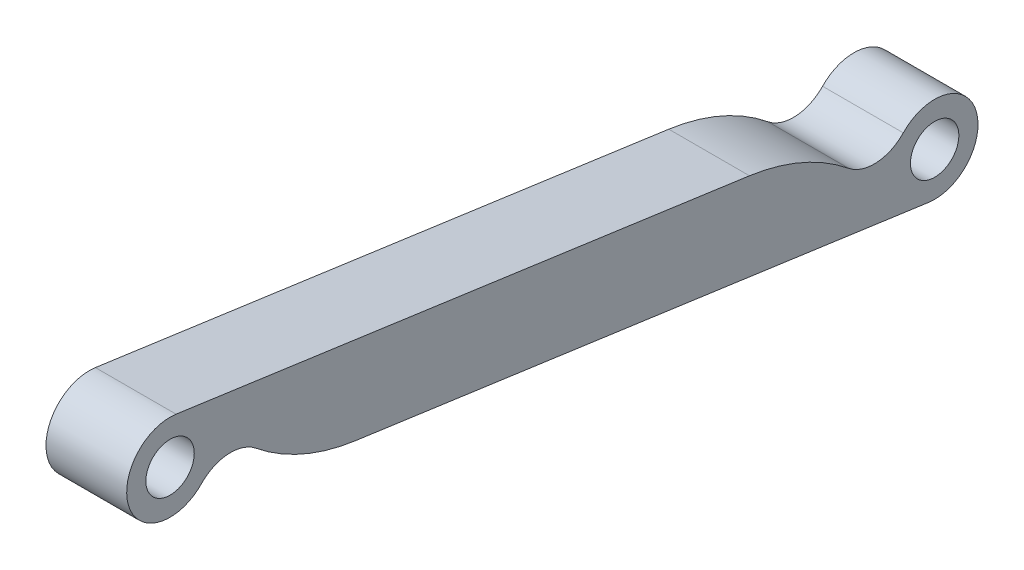
ISO-10303-21;
HEADER;
FILE_DESCRIPTION(('STEP AP214'),'2;1');
FILE_NAME('part.step','',(''),(''),'','','');
FILE_SCHEMA(('AUTOMOTIVE_DESIGN { 1 0 10303 214 1 1 1 1 }'));
ENDSEC;
DATA;
#1=APPLICATION_CONTEXT('core data for automotive mechanical design processes');
#2=APPLICATION_PROTOCOL_DEFINITION('international standard','automotive_design',2000,#1);
#3=PRODUCT_CONTEXT('',#1,'mechanical');
#4=PRODUCT('Part','Part','',(#3));
#5=PRODUCT_RELATED_PRODUCT_CATEGORY('part','',(#4));
#6=PRODUCT_DEFINITION_FORMATION('','',#4);
#7=PRODUCT_DEFINITION_CONTEXT('part definition',#1,'design');
#8=PRODUCT_DEFINITION('design','',#6,#7);
#9=PRODUCT_DEFINITION_SHAPE('','',#8);
#10=(LENGTH_UNIT() NAMED_UNIT(*) SI_UNIT(.MILLI.,.METRE.));
#11=(NAMED_UNIT(*) PLANE_ANGLE_UNIT() SI_UNIT($,.RADIAN.));
#12=(NAMED_UNIT(*) SI_UNIT($,.STERADIAN.) SOLID_ANGLE_UNIT());
#13=UNCERTAINTY_MEASURE_WITH_UNIT(LENGTH_MEASURE(1.E-05),#10,'distance_accuracy_value','');
#14=(GEOMETRIC_REPRESENTATION_CONTEXT(3) GLOBAL_UNCERTAINTY_ASSIGNED_CONTEXT((#13)) GLOBAL_UNIT_ASSIGNED_CONTEXT((#10,
#11,#12)) REPRESENTATION_CONTEXT('',''));
#15=CARTESIAN_POINT('',(0.,0.,0.));
#16=DIRECTION('',(0.,0.,1.));
#17=DIRECTION('',(1.,0.,0.));
#18=AXIS2_PLACEMENT_3D('',#15,#16,#17);
#19=CARTESIAN_POINT('',(-2.,-2.47487373415291,-40.7267905322548));
#20=DIRECTION('',(1.,0.,0.));
#21=DIRECTION('',(0.,0.,-1.));
#22=AXIS2_PLACEMENT_3D('',#19,#20,#21);
#23=CYLINDRICAL_SURFACE('',#22,2.15);
#24=DIRECTION('',(1.,0.,0.));
#25=VECTOR('',#24,1.);
#26=CARTESIAN_POINT('',(-2.,-0.989306526359159,-39.1725736647849));
#27=LINE('',#26,#25);
#28=CARTESIAN_POINT('',(-2.,-0.989306526359159,-39.1725736647849));
#29=VERTEX_POINT('',#28);
#30=CARTESIAN_POINT('',(2.,-0.989306526359159,-39.1725736647849));
#31=VERTEX_POINT('',#30);
#32=EDGE_CURVE('E108',#29,#31,#27,.T.);
#33=ORIENTED_EDGE('',*,*,#32,.T.);
#34=CARTESIAN_POINT('',(2.,-2.47487373415291,-40.7267905322548));
#35=DIRECTION('',(1.,0.,0.));
#36=DIRECTION('',(0.,0.,-1.));
#37=AXIS2_PLACEMENT_3D('',#34,#35,#36);
#38=CIRCLE('',#37,2.15);
#39=CARTESIAN_POINT('',(2.,-4.60412753999363,-40.4288337731223));
#40=VERTEX_POINT('',#39);
#41=EDGE_CURVE('E115',#40,#31,#38,.T.);
#42=ORIENTED_EDGE('',*,*,#41,.F.);
#43=DIRECTION('',(1.,0.,0.));
#44=VECTOR('',#43,1.);
#45=CARTESIAN_POINT('',(-2.,-4.60412753999363,-40.4288337731223));
#46=LINE('',#45,#44);
#47=CARTESIAN_POINT('',(-2.,-4.60412753999363,-40.4288337731223));
#48=VERTEX_POINT('',#47);
#49=EDGE_CURVE('E163',#48,#40,#46,.T.);
#50=ORIENTED_EDGE('',*,*,#49,.F.);
#51=CARTESIAN_POINT('',(-2.,-2.47487373415291,-40.7267905322548));
#52=DIRECTION('',(1.,0.,0.));
#53=DIRECTION('',(0.,0.,-1.));
#54=AXIS2_PLACEMENT_3D('',#51,#52,#53);
#55=CIRCLE('',#54,2.15);
#56=EDGE_CURVE('E121',#48,#29,#55,.T.);
#57=ORIENTED_EDGE('',*,*,#56,.T.);
#58=EDGE_LOOP('',(#33,#42,#50,#57));
#59=FACE_BOUND('',#58,.T.);
#60=ADVANCED_FACE('F39',(#59),#23,.T.);
#61=CARTESIAN_POINT('',(-2.,1.03304540486182,-0.144559028155818));
#62=DIRECTION('',(0.,-0.99035060736778,0.138584539131423));
#63=DIRECTION('',(0.,-0.138584539131423,-0.99035060736778));
#64=AXIS2_PLACEMENT_3D('',#61,#62,#63);
#65=PLANE('',#64);
#66=DIRECTION('',(0.,-0.138584539131423,-0.99035060736778));
#67=VECTOR('',#66,1.);
#68=CARTESIAN_POINT('',(2.,1.03304540486182,-0.144559028155818));
#69=LINE('',#68,#67);
#70=CARTESIAN_POINT('',(2.,-0.626904390330507,-12.0068655897107));
#71=VERTEX_POINT('',#70);
#72=EDGE_CURVE('E127',#71,#40,#69,.T.);
#73=ORIENTED_EDGE('',*,*,#72,.F.);
#74=DIRECTION('',(-1.,0.,0.));
#75=VECTOR('',#74,1.);
#76=CARTESIAN_POINT('',(-2.,-0.626904390330508,-12.0068655897107));
#77=LINE('',#76,#75);
#78=CARTESIAN_POINT('',(-2.,-0.626904390330507,-12.0068655897107));
#79=VERTEX_POINT('',#78);
#80=EDGE_CURVE('E11',#71,#79,#77,.T.);
#81=ORIENTED_EDGE('',*,*,#80,.T.);
#82=DIRECTION('',(0.,-0.138584539131423,-0.99035060736778));
#83=VECTOR('',#82,1.);
#84=CARTESIAN_POINT('',(-2.,1.03304540486182,-0.144559028155818));
#85=LINE('',#84,#83);
#86=EDGE_CURVE('E159',#79,#48,#85,.T.);
#87=ORIENTED_EDGE('',*,*,#86,.T.);
#88=ORIENTED_EDGE('',*,*,#49,.T.);
#89=EDGE_LOOP('',(#73,#81,#87,#88));
#90=FACE_BOUND('',#89,.T.);
#91=ADVANCED_FACE('F209',(#90),#65,.T.);
#92=CARTESIAN_POINT('',(-2.,-0.0390630670417487,-5.8284271247462));
#93=DIRECTION('',(1.,0.,0.));
#94=DIRECTION('',(0.,0.,-1.));
#95=AXIS2_PLACEMENT_3D('',#92,#93,#94);
#96=CYLINDRICAL_SURFACE('',#95,2.);
#97=CARTESIAN_POINT('',(-2.,-0.0390630670417487,-5.8284271247462));
#98=DIRECTION('',(1.,0.,0.));
#99=DIRECTION('',(0.,0.,-1.));
#100=AXIS2_PLACEMENT_3D('',#97,#98,#99);
#101=CIRCLE('',#100,2.);
#102=CARTESIAN_POINT('',(-2.,1.51354772468976,-7.08914110079265));
#103=VERTEX_POINT('',#102);
#104=CARTESIAN_POINT('',(-2.,1.34285991695244,-4.38264399221608));
#105=VERTEX_POINT('',#104);
#106=EDGE_CURVE('E157',#103,#105,#101,.T.);
#107=ORIENTED_EDGE('',*,*,#106,.F.);
#108=DIRECTION('',(1.,0.,0.));
#109=VECTOR('',#108,1.);
#110=CARTESIAN_POINT('',(-2.,1.51354772468976,-7.08914110079265));
#111=LINE('',#110,#109);
#112=CARTESIAN_POINT('',(2.,1.51354772468976,-7.08914110079265));
#113=VERTEX_POINT('',#112);
#114=EDGE_CURVE('E47',#103,#113,#111,.T.);
#115=ORIENTED_EDGE('',*,*,#114,.T.);
#116=CARTESIAN_POINT('',(2.,-0.0390630670417487,-5.8284271247462));
#117=DIRECTION('',(1.,0.,0.));
#118=DIRECTION('',(0.,0.,-1.));
#119=AXIS2_PLACEMENT_3D('',#116,#117,#118);
#120=CIRCLE('',#119,2.);
#121=CARTESIAN_POINT('',(2.,1.34285991695244,-4.38264399221608));
#122=VERTEX_POINT('',#121);
#123=EDGE_CURVE('E139',#113,#122,#120,.T.);
#124=ORIENTED_EDGE('',*,*,#123,.T.);
#125=DIRECTION('',(1.,0.,0.));
#126=VECTOR('',#125,1.);
#127=CARTESIAN_POINT('',(-2.,1.34285991695244,-4.38264399221608));
#128=LINE('',#127,#126);
#129=EDGE_CURVE('E165',#105,#122,#128,.T.);
#130=ORIENTED_EDGE('',*,*,#129,.F.);
#131=EDGE_LOOP('',(#107,#115,#124,#130));
#132=FACE_BOUND('',#131,.T.);
#133=ADVANCED_FACE('F182',(#132),#96,.F.);
#134=CARTESIAN_POINT('',(-2.,2.82842712474619,-2.82842712474619));
#135=DIRECTION('',(1.,0.,0.));
#136=DIRECTION('',(0.,0.,-1.));
#137=AXIS2_PLACEMENT_3D('',#134,#135,#136);
#138=CYLINDRICAL_SURFACE('',#137,2.15);
#139=ORIENTED_EDGE('',*,*,#129,.T.);
#140=CARTESIAN_POINT('',(2.,2.82842712474619,-2.82842712474619));
#141=DIRECTION('',(1.,0.,0.));
#142=DIRECTION('',(0.,0.,-1.));
#143=AXIS2_PLACEMENT_3D('',#140,#141,#142);
#144=CIRCLE('',#143,2.15);
#145=CARTESIAN_POINT('',(2.,4.95768093058691,-3.12638388387876));
#146=VERTEX_POINT('',#145);
#147=EDGE_CURVE('E136',#146,#122,#144,.T.);
#148=ORIENTED_EDGE('',*,*,#147,.F.);
#149=DIRECTION('',(1.,0.,0.));
#150=VECTOR('',#149,1.);
#151=CARTESIAN_POINT('',(-2.,4.95768093058691,-3.12638388387876));
#152=LINE('',#151,#150);
#153=CARTESIAN_POINT('',(-2.,4.95768093058691,-3.12638388387876));
#154=VERTEX_POINT('',#153);
#155=EDGE_CURVE('E122',#154,#146,#152,.T.);
#156=ORIENTED_EDGE('',*,*,#155,.F.);
#157=CARTESIAN_POINT('',(-2.,2.82842712474619,-2.82842712474619));
#158=DIRECTION('',(1.,0.,0.));
#159=DIRECTION('',(0.,0.,-1.));
#160=AXIS2_PLACEMENT_3D('',#157,#158,#159);
#161=CIRCLE('',#160,2.15);
#162=EDGE_CURVE('E154',#154,#105,#161,.T.);
#163=ORIENTED_EDGE('',*,*,#162,.T.);
#164=EDGE_LOOP('',(#139,#148,#156,#163));
#165=FACE_BOUND('',#164,.T.);
#166=ADVANCED_FACE('F188',(#165),#138,.T.);
#167=CARTESIAN_POINT('',(-2.,5.29155301654327,-0.740472546420939));
#168=DIRECTION('',(0.,-0.99035060736778,0.138584539131423));
#169=DIRECTION('',(0.,-0.138584539131424,-0.99035060736778));
#170=AXIS2_PLACEMENT_3D('',#167,#168,#169);
#171=PLANE('',#170);
#172=DIRECTION('',(0.,-0.138584539131423,-0.99035060736778));
#173=VECTOR('',#172,1.);
#174=CARTESIAN_POINT('',(2.,5.29155301654327,-0.740472546420939));
#175=LINE('',#174,#173);
#176=CARTESIAN_POINT('',(2.,0.980457780923789,-31.5483520672903));
#177=VERTEX_POINT('',#176);
#178=EDGE_CURVE('E114',#146,#177,#175,.T.);
#179=ORIENTED_EDGE('',*,*,#178,.T.);
#180=DIRECTION('',(1.,0.,0.));
#181=VECTOR('',#180,1.);
#182=CARTESIAN_POINT('',(-2.,0.980457780923787,-31.5483520672903));
#183=LINE('',#182,#181);
#184=CARTESIAN_POINT('',(-2.,0.980457780923789,-31.5483520672903));
#185=VERTEX_POINT('',#184);
#186=EDGE_CURVE('E174',#177,#185,#183,.F.);
#187=ORIENTED_EDGE('',*,*,#186,.T.);
#188=DIRECTION('',(0.,-0.138584539131423,-0.99035060736778));
#189=VECTOR('',#188,1.);
#190=CARTESIAN_POINT('',(-2.,5.29155301654327,-0.740472546420939));
#191=LINE('',#190,#189);
#192=EDGE_CURVE('E151',#154,#185,#191,.T.);
#193=ORIENTED_EDGE('',*,*,#192,.F.);
#194=ORIENTED_EDGE('',*,*,#155,.T.);
#195=EDGE_LOOP('',(#179,#187,#193,#194));
#196=FACE_BOUND('',#195,.T.);
#197=ADVANCED_FACE('F198',(#196),#171,.F.);
#198=CARTESIAN_POINT('',(-2.,0.392616457635025,-37.7267905322548));
#199=DIRECTION('',(1.,0.,0.));
#200=DIRECTION('',(0.,0.,-1.));
#201=AXIS2_PLACEMENT_3D('',#198,#199,#200);
#202=CYLINDRICAL_SURFACE('',#201,2.);
#203=CARTESIAN_POINT('',(-2.,0.392616457635025,-37.7267905322548));
#204=DIRECTION('',(1.,0.,0.));
#205=DIRECTION('',(0.,0.,-1.));
#206=AXIS2_PLACEMENT_3D('',#203,#204,#205);
#207=CIRCLE('',#206,2.);
#208=CARTESIAN_POINT('',(-2.,-1.15999433409648,-36.4660765562084));
#209=VERTEX_POINT('',#208);
#210=EDGE_CURVE('E149',#209,#29,#207,.T.);
#211=ORIENTED_EDGE('',*,*,#210,.F.);
#212=DIRECTION('',(1.,0.,0.));
#213=VECTOR('',#212,1.);
#214=CARTESIAN_POINT('',(-2.,-1.15999433409648,-36.4660765562084));
#215=LINE('',#214,#213);
#216=CARTESIAN_POINT('',(2.,-1.15999433409648,-36.4660765562084));
#217=VERTEX_POINT('',#216);
#218=EDGE_CURVE('E111',#209,#217,#215,.T.);
#219=ORIENTED_EDGE('',*,*,#218,.T.);
#220=CARTESIAN_POINT('',(2.,0.392616457635025,-37.7267905322548));
#221=DIRECTION('',(1.,0.,0.));
#222=DIRECTION('',(0.,0.,-1.));
#223=AXIS2_PLACEMENT_3D('',#220,#221,#222);
#224=CIRCLE('',#223,2.);
#225=EDGE_CURVE('E104',#217,#31,#224,.T.);
#226=ORIENTED_EDGE('',*,*,#225,.T.);
#227=ORIENTED_EDGE('',*,*,#32,.F.);
#228=EDGE_LOOP('',(#211,#219,#226,#227));
#229=FACE_BOUND('',#228,.T.);
#230=ADVANCED_FACE('F107',(#229),#202,.F.);
#231=CARTESIAN_POINT('',(-2.,-2.47487373415291,-40.7267905322548));
#232=DIRECTION('',(1.,0.,0.));
#233=DIRECTION('',(0.,0.,-1.));
#234=AXIS2_PLACEMENT_3D('',#231,#232,#233);
#235=CYLINDRICAL_SURFACE('',#234,1.2);
#236=CARTESIAN_POINT('',(-2.,-2.47487373415291,-40.7267905322548));
#237=DIRECTION('',(1.,0.,0.));
#238=DIRECTION('',(0.,0.,-1.));
#239=AXIS2_PLACEMENT_3D('',#236,#237,#238);
#240=CIRCLE('',#239,1.2);
#241=CARTESIAN_POINT('',(-2.,-2.47487373415291,-41.9267905322548));
#242=VERTEX_POINT('',#241);
#243=EDGE_CURVE('E145',#242,#242,#240,.T.);
#244=ORIENTED_EDGE('',*,*,#243,.F.);
#245=EDGE_LOOP('',(#244));
#246=FACE_BOUND('',#245,.T.);
#247=CARTESIAN_POINT('',(2.,-2.47487373415291,-40.7267905322548));
#248=DIRECTION('',(1.,0.,0.));
#249=DIRECTION('',(0.,0.,-1.));
#250=AXIS2_PLACEMENT_3D('',#247,#248,#249);
#251=CIRCLE('',#250,1.2);
#252=CARTESIAN_POINT('',(2.,-2.47487373415291,-41.9267905322548));
#253=VERTEX_POINT('',#252);
#254=EDGE_CURVE('E129',#253,#253,#251,.T.);
#255=ORIENTED_EDGE('',*,*,#254,.T.);
#256=EDGE_LOOP('',(#255));
#257=FACE_BOUND('',#256,.T.);
#258=ADVANCED_FACE('F205',(#246,#257),#235,.F.);
#259=CARTESIAN_POINT('',(-2.,2.82842712474619,-2.82842712474619));
#260=DIRECTION('',(1.,0.,0.));
#261=DIRECTION('',(0.,0.,-1.));
#262=AXIS2_PLACEMENT_3D('',#259,#260,#261);
#263=CYLINDRICAL_SURFACE('',#262,1.2);
#264=CARTESIAN_POINT('',(-2.,2.82842712474619,-2.82842712474619));
#265=DIRECTION('',(1.,0.,0.));
#266=DIRECTION('',(0.,0.,-1.));
#267=AXIS2_PLACEMENT_3D('',#264,#265,#266);
#268=CIRCLE('',#267,1.2);
#269=CARTESIAN_POINT('',(-2.,2.82842712474619,-4.02842712474619));
#270=VERTEX_POINT('',#269);
#271=EDGE_CURVE('E123',#270,#270,#268,.T.);
#272=ORIENTED_EDGE('',*,*,#271,.F.);
#273=EDGE_LOOP('',(#272));
#274=FACE_BOUND('',#273,.T.);
#275=CARTESIAN_POINT('',(2.,2.82842712474619,-2.82842712474619));
#276=DIRECTION('',(1.,0.,0.));
#277=DIRECTION('',(0.,0.,-1.));
#278=AXIS2_PLACEMENT_3D('',#275,#276,#277);
#279=CIRCLE('',#278,1.2);
#280=CARTESIAN_POINT('',(2.,2.82842712474619,-4.02842712474619));
#281=VERTEX_POINT('',#280);
#282=EDGE_CURVE('E142',#281,#281,#279,.T.);
#283=ORIENTED_EDGE('',*,*,#282,.T.);
#284=EDGE_LOOP('',(#283));
#285=FACE_BOUND('',#284,.T.);
#286=ADVANCED_FACE('F217',(#274,#285),#263,.F.);
#287=CARTESIAN_POINT('',(-2.,0.,0.));
#288=DIRECTION('',(1.,0.,0.));
#289=DIRECTION('',(0.,0.,-1.));
#290=AXIS2_PLACEMENT_3D('',#287,#288,#289);
#291=PLANE('',#290);
#292=ORIENTED_EDGE('',*,*,#243,.T.);
#293=EDGE_LOOP('',(#292));
#294=FACE_BOUND('',#293,.T.);
#295=ORIENTED_EDGE('',*,*,#192,.T.);
#296=CARTESIAN_POINT('',(-2.,-8.92304829275401,-30.1625066759761));
#297=DIRECTION('',(1.,0.,0.));
#298=DIRECTION('',(0.,0.,-1.));
#299=AXIS2_PLACEMENT_3D('',#296,#297,#298);
#300=CIRCLE('',#299,10.);
#301=EDGE_CURVE('E177',#185,#209,#300,.F.);
#302=ORIENTED_EDGE('',*,*,#301,.T.);
#303=ORIENTED_EDGE('',*,*,#210,.T.);
#304=ORIENTED_EDGE('',*,*,#56,.F.);
#305=ORIENTED_EDGE('',*,*,#86,.F.);
#306=CARTESIAN_POINT('',(-2.,9.27660168334729,-13.3927109810249));
#307=DIRECTION('',(1.,0.,0.));
#308=DIRECTION('',(0.,0.,-1.));
#309=AXIS2_PLACEMENT_3D('',#306,#307,#308);
#310=CIRCLE('',#309,10.);
#311=EDGE_CURVE('E54',#79,#103,#310,.F.);
#312=ORIENTED_EDGE('',*,*,#311,.T.);
#313=ORIENTED_EDGE('',*,*,#106,.T.);
#314=ORIENTED_EDGE('',*,*,#162,.F.);
#315=EDGE_LOOP('',(#295,#302,#303,#304,#305,#312,#313,#314));
#316=FACE_BOUND('',#315,.T.);
#317=ORIENTED_EDGE('',*,*,#271,.T.);
#318=EDGE_LOOP('',(#317));
#319=FACE_BOUND('',#318,.T.);
#320=ADVANCED_FACE('F191',(#294,#316,#319),#291,.F.);
#321=CARTESIAN_POINT('',(2.,0.,0.));
#322=DIRECTION('',(1.,0.,0.));
#323=DIRECTION('',(0.,0.,-1.));
#324=AXIS2_PLACEMENT_3D('',#321,#322,#323);
#325=PLANE('',#324);
#326=ORIENTED_EDGE('',*,*,#254,.F.);
#327=EDGE_LOOP('',(#326));
#328=FACE_BOUND('',#327,.T.);
#329=ORIENTED_EDGE('',*,*,#225,.F.);
#330=CARTESIAN_POINT('',(2.,-8.92304829275401,-30.1625066759761));
#331=DIRECTION('',(1.,0.,0.));
#332=DIRECTION('',(0.,0.,-1.));
#333=AXIS2_PLACEMENT_3D('',#330,#331,#332);
#334=CIRCLE('',#333,10.);
#335=EDGE_CURVE('E172',#217,#177,#334,.T.);
#336=ORIENTED_EDGE('',*,*,#335,.T.);
#337=ORIENTED_EDGE('',*,*,#178,.F.);
#338=ORIENTED_EDGE('',*,*,#147,.T.);
#339=ORIENTED_EDGE('',*,*,#123,.F.);
#340=CARTESIAN_POINT('',(2.,9.27660168334729,-13.3927109810249));
#341=DIRECTION('',(1.,0.,0.));
#342=DIRECTION('',(0.,0.,-1.));
#343=AXIS2_PLACEMENT_3D('',#340,#341,#342);
#344=CIRCLE('',#343,10.);
#345=EDGE_CURVE('E170',#113,#71,#344,.T.);
#346=ORIENTED_EDGE('',*,*,#345,.T.);
#347=ORIENTED_EDGE('',*,*,#72,.T.);
#348=ORIENTED_EDGE('',*,*,#41,.T.);
#349=EDGE_LOOP('',(#329,#336,#337,#338,#339,#346,#347,#348));
#350=FACE_BOUND('',#349,.T.);
#351=ORIENTED_EDGE('',*,*,#282,.F.);
#352=EDGE_LOOP('',(#351));
#353=FACE_BOUND('',#352,.T.);
#354=ADVANCED_FACE('F125',(#328,#350,#353),#325,.T.);
#355=CARTESIAN_POINT('',(-2.,-8.92304829275401,-30.1625066759761));
#356=DIRECTION('',(1.,0.,0.));
#357=DIRECTION('',(0.,0.,-1.));
#358=AXIS2_PLACEMENT_3D('',#355,#356,#357);
#359=CYLINDRICAL_SURFACE('',#358,10.);
#360=ORIENTED_EDGE('',*,*,#301,.F.);
#361=ORIENTED_EDGE('',*,*,#186,.F.);
#362=ORIENTED_EDGE('',*,*,#335,.F.);
#363=ORIENTED_EDGE('',*,*,#218,.F.);
#364=EDGE_LOOP('',(#360,#361,#362,#363));
#365=FACE_BOUND('',#364,.T.);
#366=ADVANCED_FACE('F197',(#365),#359,.T.);
#367=CARTESIAN_POINT('',(-2.,9.27660168334729,-13.3927109810249));
#368=DIRECTION('',(1.,0.,0.));
#369=DIRECTION('',(0.,0.,-1.));
#370=AXIS2_PLACEMENT_3D('',#367,#368,#369);
#371=CYLINDRICAL_SURFACE('',#370,10.);
#372=ORIENTED_EDGE('',*,*,#311,.F.);
#373=ORIENTED_EDGE('',*,*,#80,.F.);
#374=ORIENTED_EDGE('',*,*,#345,.F.);
#375=ORIENTED_EDGE('',*,*,#114,.F.);
#376=EDGE_LOOP('',(#372,#373,#374,#375));
#377=FACE_BOUND('',#376,.T.);
#378=ADVANCED_FACE('F41',(#377),#371,.T.);
#379=CLOSED_SHELL('',(#60,#91,#133,#166,#197,#230,#258,#286,#320,#354,#366,#378));
#380=MANIFOLD_SOLID_BREP('B2',#379);
#381=ADVANCED_BREP_SHAPE_REPRESENTATION('',(#18,#380),#14);
#382=SHAPE_DEFINITION_REPRESENTATION(#9,#381);
ENDSEC;
END-ISO-10303-21;
